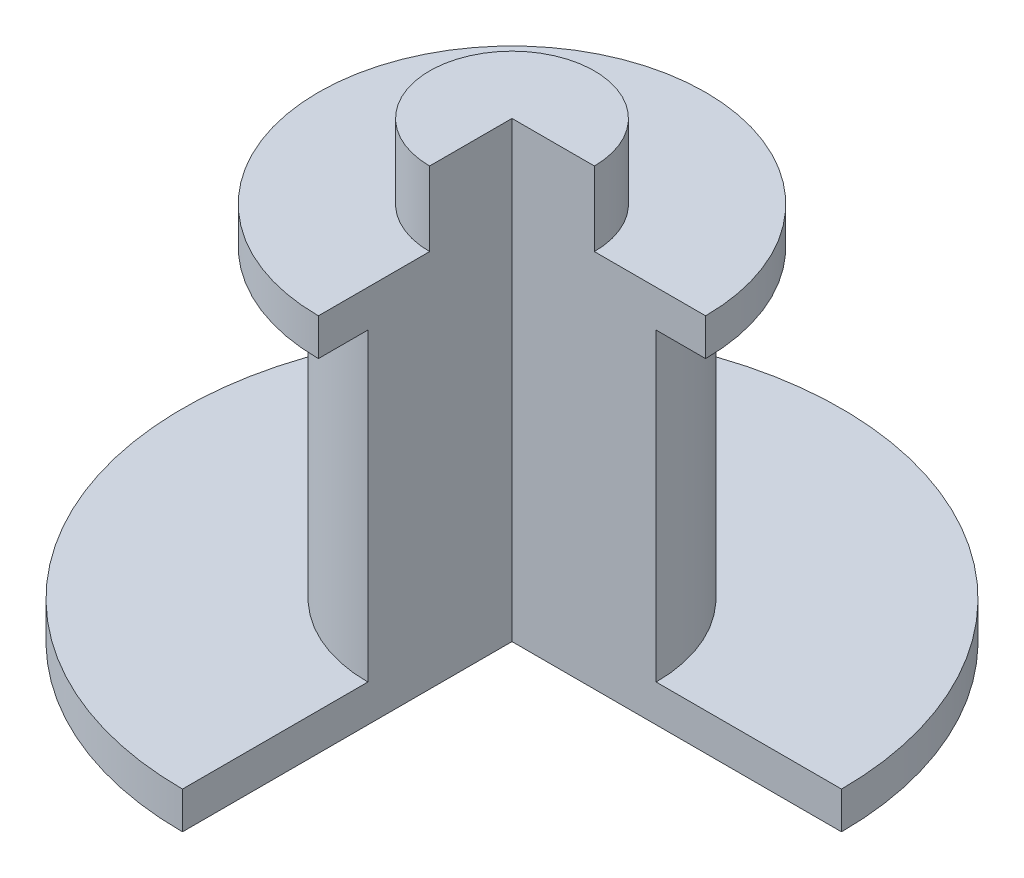
ISO-10303-21;
HEADER;
FILE_DESCRIPTION(('STEP AP214'),'2;1');
FILE_NAME('part.step','',(''),(''),'','','');
FILE_SCHEMA(('AUTOMOTIVE_DESIGN { 1 0 10303 214 1 1 1 1 }'));
ENDSEC;
DATA;
#1=APPLICATION_CONTEXT('core data for automotive mechanical design processes');
#2=APPLICATION_PROTOCOL_DEFINITION('international standard','automotive_design',2000,#1);
#3=PRODUCT_CONTEXT('',#1,'mechanical');
#4=PRODUCT('Part','Part','',(#3));
#5=PRODUCT_RELATED_PRODUCT_CATEGORY('part','',(#4));
#6=PRODUCT_DEFINITION_FORMATION('','',#4);
#7=PRODUCT_DEFINITION_CONTEXT('part definition',#1,'design');
#8=PRODUCT_DEFINITION('design','',#6,#7);
#9=PRODUCT_DEFINITION_SHAPE('','',#8);
#10=(LENGTH_UNIT() NAMED_UNIT(*) SI_UNIT(.MILLI.,.METRE.));
#11=(NAMED_UNIT(*) PLANE_ANGLE_UNIT() SI_UNIT($,.RADIAN.));
#12=(NAMED_UNIT(*) SI_UNIT($,.STERADIAN.) SOLID_ANGLE_UNIT());
#13=UNCERTAINTY_MEASURE_WITH_UNIT(LENGTH_MEASURE(1.E-05),#10,'distance_accuracy_value','');
#14=(GEOMETRIC_REPRESENTATION_CONTEXT(3) GLOBAL_UNCERTAINTY_ASSIGNED_CONTEXT((#13)) GLOBAL_UNIT_ASSIGNED_CONTEXT((#10,
#11,#12)) REPRESENTATION_CONTEXT('',''));
#15=CARTESIAN_POINT('',(0.,0.,0.));
#16=DIRECTION('',(0.,0.,1.));
#17=DIRECTION('',(1.,0.,0.));
#18=AXIS2_PLACEMENT_3D('',#15,#16,#17);
#19=CARTESIAN_POINT('',(0.,0.,0.));
#20=DIRECTION('',(0.,-1.,0.));
#21=DIRECTION('',(0.,0.,-1.));
#22=AXIS2_PLACEMENT_3D('',#19,#20,#21);
#23=PLANE('',#22);
#24=CARTESIAN_POINT('',(0.,0.,0.));
#25=DIRECTION('',(0.,1.,0.));
#26=DIRECTION('',(0.,0.,1.));
#27=AXIS2_PLACEMENT_3D('',#24,#25,#26);
#28=CIRCLE('',#27,80.);
#29=CARTESIAN_POINT('',(80.,0.,5.58637014214901E-13));
#30=VERTEX_POINT('',#29);
#31=CARTESIAN_POINT('',(2.79318507107451E-13,0.,80.));
#32=VERTEX_POINT('',#31);
#33=EDGE_CURVE('E11',#30,#32,#28,.T.);
#34=ORIENTED_EDGE('',*,*,#33,.F.);
#35=DIRECTION('',(-1.,0.,0.));
#36=VECTOR('',#35,1.);
#37=CARTESIAN_POINT('',(0.,0.,0.));
#38=LINE('',#37,#36);
#39=CARTESIAN_POINT('',(0.,0.,0.));
#40=VERTEX_POINT('',#39);
#41=EDGE_CURVE('E116',#30,#40,#38,.T.);
#42=ORIENTED_EDGE('',*,*,#41,.T.);
#43=DIRECTION('',(0.,0.,-1.));
#44=VECTOR('',#43,1.);
#45=CARTESIAN_POINT('',(0.,0.,0.));
#46=LINE('',#45,#44);
#47=EDGE_CURVE('E51',#32,#40,#46,.T.);
#48=ORIENTED_EDGE('',*,*,#47,.F.);
#49=EDGE_LOOP('',(#34,#42,#48));
#50=FACE_BOUND('',#49,.T.);
#51=ADVANCED_FACE('F37',(#50),#23,.T.);
#52=CARTESIAN_POINT('',(0.,0.,0.));
#53=DIRECTION('',(0.,1.,0.));
#54=DIRECTION('',(0.,0.,1.));
#55=AXIS2_PLACEMENT_3D('',#52,#53,#54);
#56=CYLINDRICAL_SURFACE('',#55,80.);
#57=CARTESIAN_POINT('',(0.,8.99999999999999,0.));
#58=DIRECTION('',(0.,1.,0.));
#59=DIRECTION('',(0.,0.,1.));
#60=AXIS2_PLACEMENT_3D('',#57,#58,#59);
#61=CIRCLE('',#60,80.);
#62=CARTESIAN_POINT('',(80.,8.99999999999999,5.58637014214901E-13));
#63=VERTEX_POINT('',#62);
#64=CARTESIAN_POINT('',(2.79318507107451E-13,8.99999999999999,80.));
#65=VERTEX_POINT('',#64);
#66=EDGE_CURVE('E44',#63,#65,#61,.T.);
#67=ORIENTED_EDGE('',*,*,#66,.F.);
#68=DIRECTION('',(0.,-1.,0.));
#69=VECTOR('',#68,1.);
#70=CARTESIAN_POINT('',(80.,0.,5.58637014214901E-13));
#71=LINE('',#70,#69);
#72=EDGE_CURVE('E165',#63,#30,#71,.T.);
#73=ORIENTED_EDGE('',*,*,#72,.T.);
#74=ORIENTED_EDGE('',*,*,#33,.T.);
#75=DIRECTION('',(0.,-1.,0.));
#76=VECTOR('',#75,1.);
#77=CARTESIAN_POINT('',(2.79318507107451E-13,0.,80.));
#78=LINE('',#77,#76);
#79=EDGE_CURVE('E143',#65,#32,#78,.T.);
#80=ORIENTED_EDGE('',*,*,#79,.F.);
#81=EDGE_LOOP('',(#67,#73,#74,#80));
#82=FACE_BOUND('',#81,.T.);
#83=ADVANCED_FACE('F184',(#82),#56,.T.);
#84=CARTESIAN_POINT('',(80.,8.99999999999999,5.58637014214901E-13));
#85=DIRECTION('',(0.,1.,0.));
#86=DIRECTION('',(0.,0.,1.));
#87=AXIS2_PLACEMENT_3D('',#84,#85,#86);
#88=PLANE('',#87);
#89=CARTESIAN_POINT('',(0.,8.99999999999999,0.));
#90=DIRECTION('',(0.,1.,0.));
#91=DIRECTION('',(0.,0.,1.));
#92=AXIS2_PLACEMENT_3D('',#89,#90,#91);
#93=CIRCLE('',#92,35.);
#94=CARTESIAN_POINT('',(35.,8.99999999999999,2.44403693719019E-13));
#95=VERTEX_POINT('',#94);
#96=CARTESIAN_POINT('',(1.2220184685951E-13,8.99999999999999,35.));
#97=VERTEX_POINT('',#96);
#98=EDGE_CURVE('E175',#95,#97,#93,.T.);
#99=ORIENTED_EDGE('',*,*,#98,.F.);
#100=DIRECTION('',(1.,0.,0.));
#101=VECTOR('',#100,1.);
#102=CARTESIAN_POINT('',(80.,8.99999999999999,5.58637014214901E-13));
#103=LINE('',#102,#101);
#104=EDGE_CURVE('E162',#95,#63,#103,.T.);
#105=ORIENTED_EDGE('',*,*,#104,.T.);
#106=ORIENTED_EDGE('',*,*,#66,.T.);
#107=DIRECTION('',(0.,0.,1.));
#108=VECTOR('',#107,1.);
#109=CARTESIAN_POINT('',(2.79318507107451E-13,8.99999999999999,80.));
#110=LINE('',#109,#108);
#111=EDGE_CURVE('E140',#97,#65,#110,.T.);
#112=ORIENTED_EDGE('',*,*,#111,.F.);
#113=EDGE_LOOP('',(#99,#105,#106,#112));
#114=FACE_BOUND('',#113,.T.);
#115=ADVANCED_FACE('F178',(#114),#88,.T.);
#116=CARTESIAN_POINT('',(0.,0.,0.));
#117=DIRECTION('',(0.,1.,0.));
#118=DIRECTION('',(0.,0.,1.));
#119=AXIS2_PLACEMENT_3D('',#116,#117,#118);
#120=CYLINDRICAL_SURFACE('',#119,35.);
#121=CARTESIAN_POINT('',(0.,83.,0.));
#122=DIRECTION('',(0.,1.,0.));
#123=DIRECTION('',(0.,0.,1.));
#124=AXIS2_PLACEMENT_3D('',#121,#122,#123);
#125=CIRCLE('',#124,35.);
#126=CARTESIAN_POINT('',(35.,83.,2.44403693719019E-13));
#127=VERTEX_POINT('',#126);
#128=CARTESIAN_POINT('',(1.2220184685951E-13,83.,35.));
#129=VERTEX_POINT('',#128);
#130=EDGE_CURVE('E173',#127,#129,#125,.T.);
#131=ORIENTED_EDGE('',*,*,#130,.F.);
#132=DIRECTION('',(0.,-1.,0.));
#133=VECTOR('',#132,1.);
#134=CARTESIAN_POINT('',(35.,8.99999999999999,2.44403693719019E-13));
#135=LINE('',#134,#133);
#136=EDGE_CURVE('E159',#127,#95,#135,.T.);
#137=ORIENTED_EDGE('',*,*,#136,.T.);
#138=ORIENTED_EDGE('',*,*,#98,.T.);
#139=DIRECTION('',(0.,-1.,0.));
#140=VECTOR('',#139,1.);
#141=CARTESIAN_POINT('',(1.2220184685951E-13,8.99999999999999,35.));
#142=LINE('',#141,#140);
#143=EDGE_CURVE('E137',#129,#97,#142,.T.);
#144=ORIENTED_EDGE('',*,*,#143,.F.);
#145=EDGE_LOOP('',(#131,#137,#138,#144));
#146=FACE_BOUND('',#145,.T.);
#147=ADVANCED_FACE('F195',(#146),#120,.T.);
#148=CARTESIAN_POINT('',(35.,83.,2.44403693719019E-13));
#149=DIRECTION('',(0.,-1.,0.));
#150=DIRECTION('',(0.,0.,-1.));
#151=AXIS2_PLACEMENT_3D('',#148,#149,#150);
#152=PLANE('',#151);
#153=CARTESIAN_POINT('',(0.,83.,0.));
#154=DIRECTION('',(0.,1.,0.));
#155=DIRECTION('',(0.,0.,1.));
#156=AXIS2_PLACEMENT_3D('',#153,#154,#155);
#157=CIRCLE('',#156,47.);
#158=CARTESIAN_POINT('',(47.,83.,3.28199245851255E-13));
#159=VERTEX_POINT('',#158);
#160=CARTESIAN_POINT('',(1.64099622925627E-13,83.,47.));
#161=VERTEX_POINT('',#160);
#162=EDGE_CURVE('E171',#159,#161,#157,.T.);
#163=ORIENTED_EDGE('',*,*,#162,.F.);
#164=DIRECTION('',(-1.,0.,0.));
#165=VECTOR('',#164,1.);
#166=CARTESIAN_POINT('',(35.,83.,2.44403693719019E-13));
#167=LINE('',#166,#165);
#168=EDGE_CURVE('E156',#159,#127,#167,.T.);
#169=ORIENTED_EDGE('',*,*,#168,.T.);
#170=ORIENTED_EDGE('',*,*,#130,.T.);
#171=DIRECTION('',(0.,0.,-1.));
#172=VECTOR('',#171,1.);
#173=CARTESIAN_POINT('',(1.2220184685951E-13,83.,35.));
#174=LINE('',#173,#172);
#175=EDGE_CURVE('E134',#161,#129,#174,.T.);
#176=ORIENTED_EDGE('',*,*,#175,.F.);
#177=EDGE_LOOP('',(#163,#169,#170,#176));
#178=FACE_BOUND('',#177,.T.);
#179=ADVANCED_FACE('F200',(#178),#152,.T.);
#180=CARTESIAN_POINT('',(0.,0.,0.));
#181=DIRECTION('',(0.,1.,0.));
#182=DIRECTION('',(0.,0.,1.));
#183=AXIS2_PLACEMENT_3D('',#180,#181,#182);
#184=CYLINDRICAL_SURFACE('',#183,47.);
#185=CARTESIAN_POINT('',(0.,92.,0.));
#186=DIRECTION('',(0.,1.,0.));
#187=DIRECTION('',(0.,0.,1.));
#188=AXIS2_PLACEMENT_3D('',#185,#186,#187);
#189=CIRCLE('',#188,47.);
#190=CARTESIAN_POINT('',(47.,92.,3.28199245851255E-13));
#191=VERTEX_POINT('',#190);
#192=CARTESIAN_POINT('',(1.64099622925627E-13,92.,47.));
#193=VERTEX_POINT('',#192);
#194=EDGE_CURVE('E169',#191,#193,#189,.T.);
#195=ORIENTED_EDGE('',*,*,#194,.F.);
#196=DIRECTION('',(0.,-1.,0.));
#197=VECTOR('',#196,1.);
#198=CARTESIAN_POINT('',(47.,83.,3.28199245851255E-13));
#199=LINE('',#198,#197);
#200=EDGE_CURVE('E153',#191,#159,#199,.T.);
#201=ORIENTED_EDGE('',*,*,#200,.T.);
#202=ORIENTED_EDGE('',*,*,#162,.T.);
#203=DIRECTION('',(0.,-1.,0.));
#204=VECTOR('',#203,1.);
#205=CARTESIAN_POINT('',(1.64099622925627E-13,83.,47.));
#206=LINE('',#205,#204);
#207=EDGE_CURVE('E129',#193,#161,#206,.T.);
#208=ORIENTED_EDGE('',*,*,#207,.F.);
#209=EDGE_LOOP('',(#195,#201,#202,#208));
#210=FACE_BOUND('',#209,.T.);
#211=ADVANCED_FACE('F204',(#210),#184,.T.);
#212=CARTESIAN_POINT('',(47.,92.,3.28199245851255E-13));
#213=DIRECTION('',(0.,1.,0.));
#214=DIRECTION('',(0.,0.,1.));
#215=AXIS2_PLACEMENT_3D('',#212,#213,#214);
#216=PLANE('',#215);
#217=CARTESIAN_POINT('',(0.,92.,0.));
#218=DIRECTION('',(0.,1.,0.));
#219=DIRECTION('',(0.,0.,1.));
#220=AXIS2_PLACEMENT_3D('',#217,#218,#219);
#221=CIRCLE('',#220,20.);
#222=CARTESIAN_POINT('',(20.,92.,1.39659253553725E-13));
#223=VERTEX_POINT('',#222);
#224=CARTESIAN_POINT('',(0.,92.,20.));
#225=VERTEX_POINT('',#224);
#226=EDGE_CURVE('E115',#223,#225,#221,.T.);
#227=ORIENTED_EDGE('',*,*,#226,.F.);
#228=DIRECTION('',(1.,0.,0.));
#229=VECTOR('',#228,1.);
#230=CARTESIAN_POINT('',(47.,92.,3.28199245851255E-13));
#231=LINE('',#230,#229);
#232=EDGE_CURVE('E150',#223,#191,#231,.T.);
#233=ORIENTED_EDGE('',*,*,#232,.T.);
#234=ORIENTED_EDGE('',*,*,#194,.T.);
#235=DIRECTION('',(0.,0.,1.));
#236=VECTOR('',#235,1.);
#237=CARTESIAN_POINT('',(1.64099622925627E-13,92.,47.));
#238=LINE('',#237,#236);
#239=EDGE_CURVE('E127',#225,#193,#238,.T.);
#240=ORIENTED_EDGE('',*,*,#239,.F.);
#241=EDGE_LOOP('',(#227,#233,#234,#240));
#242=FACE_BOUND('',#241,.T.);
#243=ADVANCED_FACE('F208',(#242),#216,.T.);
#244=CARTESIAN_POINT('',(0.,0.,0.));
#245=DIRECTION('',(0.,1.,0.));
#246=DIRECTION('',(0.,0.,1.));
#247=AXIS2_PLACEMENT_3D('',#244,#245,#246);
#248=CYLINDRICAL_SURFACE('',#247,20.);
#249=CARTESIAN_POINT('',(0.,110.,0.));
#250=DIRECTION('',(0.,1.,0.));
#251=DIRECTION('',(0.,0.,1.));
#252=AXIS2_PLACEMENT_3D('',#249,#250,#251);
#253=CIRCLE('',#252,20.);
#254=CARTESIAN_POINT('',(20.,110.,1.39659253553725E-13));
#255=VERTEX_POINT('',#254);
#256=CARTESIAN_POINT('',(0.,110.,20.));
#257=VERTEX_POINT('',#256);
#258=EDGE_CURVE('E105',#255,#257,#253,.T.);
#259=ORIENTED_EDGE('',*,*,#258,.F.);
#260=DIRECTION('',(0.,-1.,0.));
#261=VECTOR('',#260,1.);
#262=CARTESIAN_POINT('',(20.,92.,1.39659253553725E-13));
#263=LINE('',#262,#261);
#264=EDGE_CURVE('E148',#255,#223,#263,.T.);
#265=ORIENTED_EDGE('',*,*,#264,.T.);
#266=ORIENTED_EDGE('',*,*,#226,.T.);
#267=DIRECTION('',(0.,-1.,0.));
#268=VECTOR('',#267,1.);
#269=CARTESIAN_POINT('',(0.,92.,20.));
#270=LINE('',#269,#268);
#271=EDGE_CURVE('E121',#257,#225,#270,.T.);
#272=ORIENTED_EDGE('',*,*,#271,.F.);
#273=EDGE_LOOP('',(#259,#265,#266,#272));
#274=FACE_BOUND('',#273,.T.);
#275=ADVANCED_FACE('F126',(#274),#248,.T.);
#276=CARTESIAN_POINT('',(20.,110.,1.39659253553725E-13));
#277=DIRECTION('',(0.,1.,0.));
#278=DIRECTION('',(0.,0.,1.));
#279=AXIS2_PLACEMENT_3D('',#276,#277,#278);
#280=PLANE('',#279);
#281=DIRECTION('',(1.,0.,0.));
#282=VECTOR('',#281,1.);
#283=CARTESIAN_POINT('',(20.,110.,1.39659253553725E-13));
#284=LINE('',#283,#282);
#285=CARTESIAN_POINT('',(0.,110.,0.));
#286=VERTEX_POINT('',#285);
#287=EDGE_CURVE('E110',#286,#255,#284,.T.);
#288=ORIENTED_EDGE('',*,*,#287,.T.);
#289=ORIENTED_EDGE('',*,*,#258,.T.);
#290=DIRECTION('',(0.,0.,1.));
#291=VECTOR('',#290,1.);
#292=CARTESIAN_POINT('',(0.,110.,20.));
#293=LINE('',#292,#291);
#294=EDGE_CURVE('E108',#286,#257,#293,.T.);
#295=ORIENTED_EDGE('',*,*,#294,.F.);
#296=EDGE_LOOP('',(#288,#289,#295));
#297=FACE_BOUND('',#296,.T.);
#298=ADVANCED_FACE('F107',(#297),#280,.T.);
#299=CARTESIAN_POINT('',(0.,0.,0.));
#300=DIRECTION('',(0.,0.,1.));
#301=DIRECTION('',(1.,0.,0.));
#302=AXIS2_PLACEMENT_3D('',#299,#300,#301);
#303=PLANE('',#302);
#304=DIRECTION('',(0.,1.,0.));
#305=VECTOR('',#304,1.);
#306=CARTESIAN_POINT('',(0.,110.,0.));
#307=LINE('',#306,#305);
#308=EDGE_CURVE('E124',#40,#286,#307,.T.);
#309=ORIENTED_EDGE('',*,*,#308,.F.);
#310=ORIENTED_EDGE('',*,*,#41,.F.);
#311=ORIENTED_EDGE('',*,*,#72,.F.);
#312=ORIENTED_EDGE('',*,*,#104,.F.);
#313=ORIENTED_EDGE('',*,*,#136,.F.);
#314=ORIENTED_EDGE('',*,*,#168,.F.);
#315=ORIENTED_EDGE('',*,*,#200,.F.);
#316=ORIENTED_EDGE('',*,*,#232,.F.);
#317=ORIENTED_EDGE('',*,*,#264,.F.);
#318=ORIENTED_EDGE('',*,*,#287,.F.);
#319=EDGE_LOOP('',(#309,#310,#311,#312,#313,#314,#315,#316,#317,#318));
#320=FACE_BOUND('',#319,.T.);
#321=ADVANCED_FACE('F187',(#320),#303,.T.);
#322=CARTESIAN_POINT('',(0.,0.,0.));
#323=DIRECTION('',(-1.,0.,0.));
#324=DIRECTION('',(0.,0.,1.));
#325=AXIS2_PLACEMENT_3D('',#322,#323,#324);
#326=PLANE('',#325);
#327=ORIENTED_EDGE('',*,*,#308,.T.);
#328=ORIENTED_EDGE('',*,*,#294,.T.);
#329=ORIENTED_EDGE('',*,*,#271,.T.);
#330=ORIENTED_EDGE('',*,*,#239,.T.);
#331=ORIENTED_EDGE('',*,*,#207,.T.);
#332=ORIENTED_EDGE('',*,*,#175,.T.);
#333=ORIENTED_EDGE('',*,*,#143,.T.);
#334=ORIENTED_EDGE('',*,*,#111,.T.);
#335=ORIENTED_EDGE('',*,*,#79,.T.);
#336=ORIENTED_EDGE('',*,*,#47,.T.);
#337=EDGE_LOOP('',(#327,#328,#329,#330,#331,#332,#333,#334,#335,#336));
#338=FACE_BOUND('',#337,.T.);
#339=ADVANCED_FACE('F119',(#338),#326,.F.);
#340=CLOSED_SHELL('',(#51,#83,#115,#147,#179,#211,#243,#275,#298,#321,#339));
#341=MANIFOLD_SOLID_BREP('B2',#340);
#342=ADVANCED_BREP_SHAPE_REPRESENTATION('',(#18,#341),#14);
#343=SHAPE_DEFINITION_REPRESENTATION(#9,#342);
ENDSEC;
END-ISO-10303-21;
